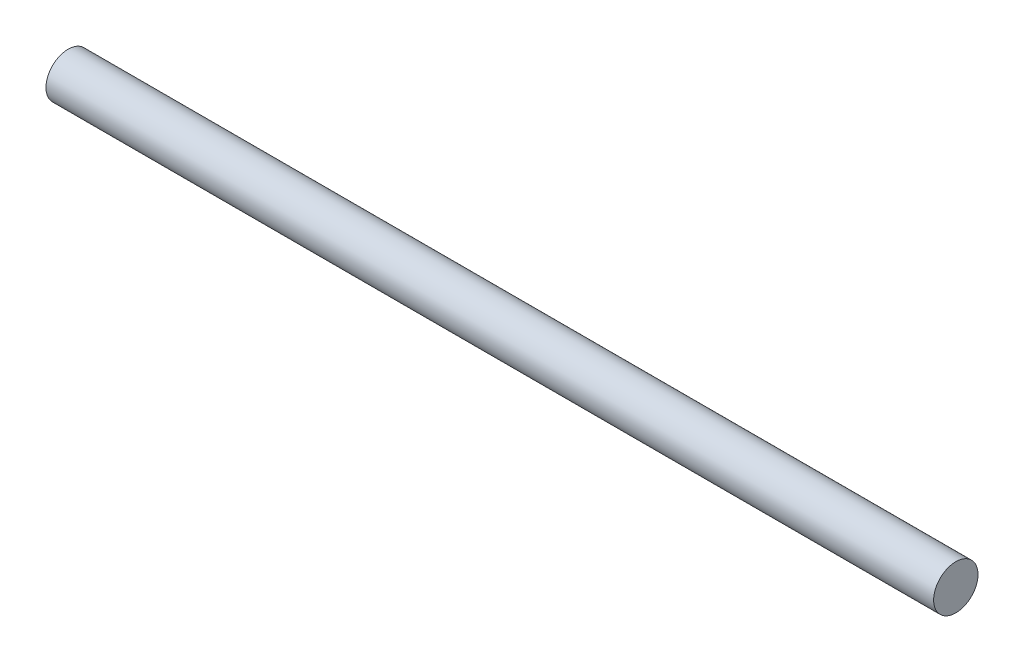
ISO-10303-21;
HEADER;
FILE_DESCRIPTION(('STEP AP214'),'2;1');
FILE_NAME('part.step','',(''),(''),'','','');
FILE_SCHEMA(('AUTOMOTIVE_DESIGN { 1 0 10303 214 1 1 1 1 }'));
ENDSEC;
DATA;
#1=APPLICATION_CONTEXT('core data for automotive mechanical design processes');
#2=APPLICATION_PROTOCOL_DEFINITION('international standard','automotive_design',2000,#1);
#3=PRODUCT_CONTEXT('',#1,'mechanical');
#4=PRODUCT('Part','Part','',(#3));
#5=PRODUCT_RELATED_PRODUCT_CATEGORY('part','',(#4));
#6=PRODUCT_DEFINITION_FORMATION('','',#4);
#7=PRODUCT_DEFINITION_CONTEXT('part definition',#1,'design');
#8=PRODUCT_DEFINITION('design','',#6,#7);
#9=PRODUCT_DEFINITION_SHAPE('','',#8);
#10=(LENGTH_UNIT() NAMED_UNIT(*) SI_UNIT(.MILLI.,.METRE.));
#11=(NAMED_UNIT(*) PLANE_ANGLE_UNIT() SI_UNIT($,.RADIAN.));
#12=(NAMED_UNIT(*) SI_UNIT($,.STERADIAN.) SOLID_ANGLE_UNIT());
#13=UNCERTAINTY_MEASURE_WITH_UNIT(LENGTH_MEASURE(1.E-05),#10,'distance_accuracy_value','');
#14=(GEOMETRIC_REPRESENTATION_CONTEXT(3) GLOBAL_UNCERTAINTY_ASSIGNED_CONTEXT((#13)) GLOBAL_UNIT_ASSIGNED_CONTEXT((#10,
#11,#12)) REPRESENTATION_CONTEXT('',''));
#15=CARTESIAN_POINT('',(0.,0.,0.));
#16=DIRECTION('',(0.,0.,1.));
#17=DIRECTION('',(1.,0.,0.));
#18=AXIS2_PLACEMENT_3D('',#15,#16,#17);
#19=CARTESIAN_POINT('',(100.,0.,0.));
#20=DIRECTION('',(-1.,0.,0.));
#21=DIRECTION('',(0.,0.,1.));
#22=AXIS2_PLACEMENT_3D('',#19,#20,#21);
#23=CYLINDRICAL_SURFACE('',#22,2.5);
#24=CARTESIAN_POINT('',(100.,0.,0.));
#25=DIRECTION('',(1.,0.,0.));
#26=DIRECTION('',(0.,0.,-1.));
#27=AXIS2_PLACEMENT_3D('',#24,#25,#26);
#28=CIRCLE('',#27,2.5);
#29=CARTESIAN_POINT('',(100.,0.,-2.5));
#30=VERTEX_POINT('',#29);
#31=EDGE_CURVE('E10',#30,#30,#28,.T.);
#32=ORIENTED_EDGE('',*,*,#31,.F.);
#33=EDGE_LOOP('',(#32));
#34=FACE_BOUND('',#33,.T.);
#35=CARTESIAN_POINT('',(0.,0.,0.));
#36=DIRECTION('',(1.,0.,0.));
#37=DIRECTION('',(0.,0.,-1.));
#38=AXIS2_PLACEMENT_3D('',#35,#36,#37);
#39=CIRCLE('',#38,2.5);
#40=CARTESIAN_POINT('',(0.,0.,-2.5));
#41=VERTEX_POINT('',#40);
#42=EDGE_CURVE('E40',#41,#41,#39,.T.);
#43=ORIENTED_EDGE('',*,*,#42,.T.);
#44=EDGE_LOOP('',(#43));
#45=FACE_BOUND('',#44,.T.);
#46=ADVANCED_FACE('F37',(#34,#45),#23,.T.);
#47=CARTESIAN_POINT('',(100.,0.,0.));
#48=DIRECTION('',(1.,0.,0.));
#49=DIRECTION('',(0.,0.,-1.));
#50=AXIS2_PLACEMENT_3D('',#47,#48,#49);
#51=PLANE('',#50);
#52=ORIENTED_EDGE('',*,*,#31,.T.);
#53=EDGE_LOOP('',(#52));
#54=FACE_BOUND('',#53,.T.);
#55=ADVANCED_FACE('F54',(#54),#51,.T.);
#56=CARTESIAN_POINT('',(0.,0.,0.));
#57=DIRECTION('',(1.,0.,0.));
#58=DIRECTION('',(0.,0.,-1.));
#59=AXIS2_PLACEMENT_3D('',#56,#57,#58);
#60=PLANE('',#59);
#61=ORIENTED_EDGE('',*,*,#42,.F.);
#62=EDGE_LOOP('',(#61));
#63=FACE_BOUND('',#62,.T.);
#64=ADVANCED_FACE('F52',(#63),#60,.F.);
#65=CLOSED_SHELL('',(#46,#55,#64));
#66=MANIFOLD_SOLID_BREP('B2',#65);
#67=ADVANCED_BREP_SHAPE_REPRESENTATION('',(#18,#66),#14);
#68=SHAPE_DEFINITION_REPRESENTATION(#9,#67);
ENDSEC;
END-ISO-10303-21;
